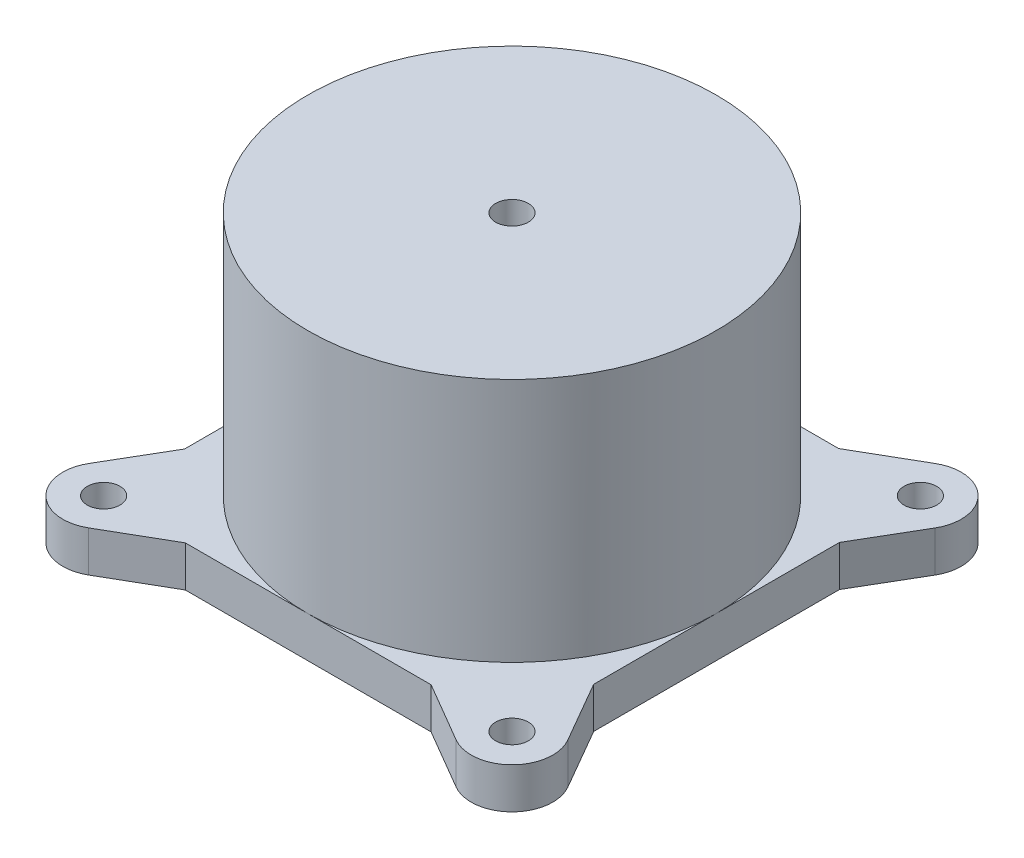
ISO-10303-21;
HEADER;
FILE_DESCRIPTION(('STEP AP214'),'2;1');
FILE_NAME('part.step','',(''),(''),'','','');
FILE_SCHEMA(('AUTOMOTIVE_DESIGN { 1 0 10303 214 1 1 1 1 }'));
ENDSEC;
DATA;
#1=APPLICATION_CONTEXT('core data for automotive mechanical design processes');
#2=APPLICATION_PROTOCOL_DEFINITION('international standard','automotive_design',2000,#1);
#3=PRODUCT_CONTEXT('',#1,'mechanical');
#4=PRODUCT('Part','Part','',(#3));
#5=PRODUCT_RELATED_PRODUCT_CATEGORY('part','',(#4));
#6=PRODUCT_DEFINITION_FORMATION('','',#4);
#7=PRODUCT_DEFINITION_CONTEXT('part definition',#1,'design');
#8=PRODUCT_DEFINITION('design','',#6,#7);
#9=PRODUCT_DEFINITION_SHAPE('','',#8);
#10=(LENGTH_UNIT() NAMED_UNIT(*) SI_UNIT(.MILLI.,.METRE.));
#11=(NAMED_UNIT(*) PLANE_ANGLE_UNIT() SI_UNIT($,.RADIAN.));
#12=(NAMED_UNIT(*) SI_UNIT($,.STERADIAN.) SOLID_ANGLE_UNIT());
#13=UNCERTAINTY_MEASURE_WITH_UNIT(LENGTH_MEASURE(1.E-05),#10,'distance_accuracy_value','');
#14=(GEOMETRIC_REPRESENTATION_CONTEXT(3) GLOBAL_UNCERTAINTY_ASSIGNED_CONTEXT((#13)) GLOBAL_UNIT_ASSIGNED_CONTEXT((#10,
#11,#12)) REPRESENTATION_CONTEXT('',''));
#15=CARTESIAN_POINT('',(0.,0.,0.));
#16=DIRECTION('',(0.,0.,1.));
#17=DIRECTION('',(1.,0.,0.));
#18=AXIS2_PLACEMENT_3D('',#15,#16,#17);
#19=CARTESIAN_POINT('',(0.,0.,0.));
#20=DIRECTION('',(0.,1.,0.));
#21=DIRECTION('',(0.,0.,1.));
#22=AXIS2_PLACEMENT_3D('',#19,#20,#21);
#23=PLANE('',#22);
#24=CARTESIAN_POINT('',(0.,0.,0.));
#25=DIRECTION('',(0.,1.,0.));
#26=DIRECTION('',(0.,0.,1.));
#27=AXIS2_PLACEMENT_3D('',#24,#25,#26);
#28=CIRCLE('',#27,4.);
#29=CARTESIAN_POINT('',(0.,0.,4.));
#30=VERTEX_POINT('',#29);
#31=EDGE_CURVE('E210',#30,#30,#28,.T.);
#32=ORIENTED_EDGE('',*,*,#31,.T.);
#33=EDGE_LOOP('',(#32));
#34=FACE_BOUND('',#33,.T.);
#35=CARTESIAN_POINT('',(0.,0.,0.));
#36=DIRECTION('',(0.,-1.,0.));
#37=DIRECTION('',(0.,0.,-1.));
#38=AXIS2_PLACEMENT_3D('',#35,#36,#37);
#39=CIRCLE('',#38,40.);
#40=CARTESIAN_POINT('',(0.,0.,-40.));
#41=VERTEX_POINT('',#40);
#42=EDGE_CURVE('E198',#41,#41,#39,.T.);
#43=ORIENTED_EDGE('',*,*,#42,.T.);
#44=EDGE_LOOP('',(#43));
#45=FACE_BOUND('',#44,.T.);
#46=ADVANCED_FACE('F50',(#34,#45),#23,.F.);
#47=CARTESIAN_POINT('',(0.,10.,0.));
#48=DIRECTION('',(0.,1.,0.));
#49=DIRECTION('',(0.,0.,1.));
#50=AXIS2_PLACEMENT_3D('',#47,#48,#49);
#51=PLANE('',#50);
#52=CARTESIAN_POINT('',(0.,10.,0.));
#53=DIRECTION('',(0.,1.,0.));
#54=DIRECTION('',(0.,0.,1.));
#55=AXIS2_PLACEMENT_3D('',#52,#53,#54);
#56=CIRCLE('',#55,50.);
#57=CARTESIAN_POINT('',(0.,10.,50.));
#58=VERTEX_POINT('',#57);
#59=EDGE_CURVE('E11',#58,#58,#56,.T.);
#60=ORIENTED_EDGE('',*,*,#59,.T.);
#61=EDGE_LOOP('',(#60));
#62=FACE_BOUND('',#61,.T.);
#63=CARTESIAN_POINT('',(0.,10.,0.));
#64=DIRECTION('',(0.,1.,0.));
#65=DIRECTION('',(0.,0.,1.));
#66=AXIS2_PLACEMENT_3D('',#63,#64,#65);
#67=CIRCLE('',#66,4.);
#68=CARTESIAN_POINT('',(0.,10.,4.));
#69=VERTEX_POINT('',#68);
#70=EDGE_CURVE('E54',#69,#69,#67,.T.);
#71=ORIENTED_EDGE('',*,*,#70,.F.);
#72=EDGE_LOOP('',(#71));
#73=FACE_BOUND('',#72,.T.);
#74=ADVANCED_FACE('F230',(#62,#73),#51,.T.);
#75=CARTESIAN_POINT('',(0.,10.,0.));
#76=DIRECTION('',(0.,-1.,0.));
#77=DIRECTION('',(0.,0.,-1.));
#78=AXIS2_PLACEMENT_3D('',#75,#76,#77);
#79=CYLINDRICAL_SURFACE('',#78,50.);
#80=ORIENTED_EDGE('',*,*,#59,.F.);
#81=EDGE_LOOP('',(#80));
#82=FACE_BOUND('',#81,.T.);
#83=CARTESIAN_POINT('',(0.,-50.,0.));
#84=DIRECTION('',(0.,-1.,0.));
#85=DIRECTION('',(0.,0.,-1.));
#86=AXIS2_PLACEMENT_3D('',#83,#84,#85);
#87=CIRCLE('',#86,50.);
#88=CARTESIAN_POINT('',(-2.35922392732846E-13,-50.,-50.0000000000002));
#89=VERTEX_POINT('',#88);
#90=CARTESIAN_POINT('',(49.9999999999999,-50.,-4.15060205382177E-13));
#91=VERTEX_POINT('',#90);
#92=EDGE_CURVE('E204',#89,#91,#87,.T.);
#93=ORIENTED_EDGE('',*,*,#92,.F.);
#94=CARTESIAN_POINT('',(-49.9999999999999,-50.,0.));
#95=VERTEX_POINT('',#94);
#96=EDGE_CURVE('E64',#95,#89,#87,.T.);
#97=ORIENTED_EDGE('',*,*,#96,.F.);
#98=CARTESIAN_POINT('',(2.36353728064851E-13,-50.,49.9999999999999));
#99=VERTEX_POINT('',#98);
#100=EDGE_CURVE('E67',#99,#95,#87,.T.);
#101=ORIENTED_EDGE('',*,*,#100,.F.);
#102=EDGE_CURVE('E208',#91,#99,#87,.T.);
#103=ORIENTED_EDGE('',*,*,#102,.F.);
#104=EDGE_LOOP('',(#93,#97,#101,#103));
#105=FACE_BOUND('',#104,.T.);
#106=ADVANCED_FACE('F47',(#82,#105),#79,.T.);
#107=CARTESIAN_POINT('',(0.,10.,0.));
#108=DIRECTION('',(0.,-1.,0.));
#109=DIRECTION('',(0.,0.,-1.));
#110=AXIS2_PLACEMENT_3D('',#107,#108,#109);
#111=CYLINDRICAL_SURFACE('',#110,4.);
#112=ORIENTED_EDGE('',*,*,#70,.T.);
#113=EDGE_LOOP('',(#112));
#114=FACE_BOUND('',#113,.T.);
#115=ORIENTED_EDGE('',*,*,#31,.F.);
#116=EDGE_LOOP('',(#115));
#117=FACE_BOUND('',#116,.T.);
#118=ADVANCED_FACE('F214',(#114,#117),#111,.F.);
#119=CARTESIAN_POINT('',(0.,-50.,0.));
#120=DIRECTION('',(0.,1.,0.));
#121=DIRECTION('',(0.,0.,1.));
#122=AXIS2_PLACEMENT_3D('',#119,#120,#121);
#123=CYLINDRICAL_SURFACE('',#122,40.);
#124=ORIENTED_EDGE('',*,*,#42,.F.);
#125=EDGE_LOOP('',(#124));
#126=FACE_BOUND('',#125,.T.);
#127=CARTESIAN_POINT('',(0.,-60.,0.));
#128=DIRECTION('',(0.,-1.,0.));
#129=DIRECTION('',(0.,0.,-1.));
#130=AXIS2_PLACEMENT_3D('',#127,#128,#129);
#131=CIRCLE('',#130,40.);
#132=CARTESIAN_POINT('',(0.,-60.,-40.));
#133=VERTEX_POINT('',#132);
#134=EDGE_CURVE('E387',#133,#133,#131,.T.);
#135=ORIENTED_EDGE('',*,*,#134,.T.);
#136=EDGE_LOOP('',(#135));
#137=FACE_BOUND('',#136,.T.);
#138=ADVANCED_FACE('F220',(#126,#137),#123,.F.);
#139=CARTESIAN_POINT('',(-50.,-50.,-50.));
#140=DIRECTION('',(0.,-1.,0.));
#141=DIRECTION('',(0.,0.,-1.));
#142=AXIS2_PLACEMENT_3D('',#139,#140,#141);
#143=PLANE('',#142);
#144=CARTESIAN_POINT('',(50.,-50.,-50.));
#145=DIRECTION('',(0.,-1.,0.));
#146=DIRECTION('',(0.,0.,1.));
#147=AXIS2_PLACEMENT_3D('',#144,#145,#146);
#148=CIRCLE('',#147,4.00000000000003);
#149=CARTESIAN_POINT('',(50.,-50.,-46.));
#150=VERTEX_POINT('',#149);
#151=EDGE_CURVE('E380',#150,#150,#148,.T.);
#152=ORIENTED_EDGE('',*,*,#151,.T.);
#153=EDGE_LOOP('',(#152));
#154=FACE_BOUND('',#153,.T.);
#155=DIRECTION('',(1.,0.,0.));
#156=VECTOR('',#155,1.);
#157=CARTESIAN_POINT('',(-30.1866521598413,-50.,-50.));
#158=LINE('',#157,#156);
#159=CARTESIAN_POINT('',(29.9974313300821,-50.,-50.0000000000003));
#160=VERTEX_POINT('',#159);
#161=EDGE_CURVE('E255',#89,#160,#158,.T.);
#162=ORIENTED_EDGE('',*,*,#161,.F.);
#163=ORIENTED_EDGE('',*,*,#92,.T.);
#164=DIRECTION('',(0.,0.,1.));
#165=VECTOR('',#164,1.);
#166=CARTESIAN_POINT('',(50.0000000000002,-50.,29.9974313300822));
#167=LINE('',#166,#165);
#168=CARTESIAN_POINT('',(49.9999999999997,-50.,-30.1866521598418));
#169=VERTEX_POINT('',#168);
#170=EDGE_CURVE('E275',#169,#91,#167,.T.);
#171=ORIENTED_EDGE('',*,*,#170,.F.);
#172=DIRECTION('',(-0.504710263034463,0.,0.863288798947191));
#173=VECTOR('',#172,1.);
#174=CARTESIAN_POINT('',(58.6328879894714,-50.,-44.9528973696559));
#175=LINE('',#174,#173);
#176=CARTESIAN_POINT('',(58.6328879894714,-50.,-44.9528973696559));
#177=VERTEX_POINT('',#176);
#178=EDGE_CURVE('E267',#177,#169,#175,.T.);
#179=ORIENTED_EDGE('',*,*,#178,.F.);
#180=CARTESIAN_POINT('',(49.9999999999995,-50.,-50.0000000000005));
#181=DIRECTION('',(0.,-1.,0.));
#182=DIRECTION('',(0.,0.,-1.));
#183=AXIS2_PLACEMENT_3D('',#180,#181,#182);
#184=CIRCLE('',#183,9.99999999999999);
#185=CARTESIAN_POINT('',(45.0006420850135,-50.,-58.6606247140651));
#186=VERTEX_POINT('',#185);
#187=EDGE_CURVE('E263',#186,#177,#184,.T.);
#188=ORIENTED_EDGE('',*,*,#187,.F.);
#189=DIRECTION('',(0.866062471406464,0.,-0.499935791498596));
#190=VECTOR('',#189,1.);
#191=CARTESIAN_POINT('',(45.0006420850135,-50.,-58.6606247140652));
#192=LINE('',#191,#190);
#193=EDGE_CURVE('E258',#160,#186,#192,.T.);
#194=ORIENTED_EDGE('',*,*,#193,.F.);
#195=EDGE_LOOP('',(#162,#163,#171,#179,#188,#194));
#196=FACE_BOUND('',#195,.T.);
#197=ADVANCED_FACE('F223',(#154,#196),#143,.F.);
#198=CARTESIAN_POINT('',(50.,-50.,50.));
#199=DIRECTION('',(0.,-1.,0.));
#200=DIRECTION('',(0.,0.,1.));
#201=AXIS2_PLACEMENT_3D('',#198,#199,#200);
#202=CIRCLE('',#201,4.00000000000001);
#203=CARTESIAN_POINT('',(50.,-50.,54.));
#204=VERTEX_POINT('',#203);
#205=EDGE_CURVE('E382',#204,#204,#202,.T.);
#206=ORIENTED_EDGE('',*,*,#205,.T.);
#207=EDGE_LOOP('',(#206));
#208=FACE_BOUND('',#207,.T.);
#209=CARTESIAN_POINT('',(50.0000000000002,-50.,29.9974313300822));
#210=VERTEX_POINT('',#209);
#211=EDGE_CURVE('E271',#91,#210,#167,.T.);
#212=ORIENTED_EDGE('',*,*,#211,.F.);
#213=ORIENTED_EDGE('',*,*,#102,.T.);
#214=DIRECTION('',(-1.,0.,0.));
#215=VECTOR('',#214,1.);
#216=CARTESIAN_POINT('',(-29.9974313300824,-50.,50.0000000000001));
#217=LINE('',#216,#215);
#218=CARTESIAN_POINT('',(30.1866521598416,-50.,49.9999999999998));
#219=VERTEX_POINT('',#218);
#220=EDGE_CURVE('E284',#219,#99,#217,.T.);
#221=ORIENTED_EDGE('',*,*,#220,.F.);
#222=DIRECTION('',(-0.863288798947189,0.,-0.504710263034466));
#223=VECTOR('',#222,1.);
#224=CARTESIAN_POINT('',(44.9528973696557,-50.,58.6328879894715));
#225=LINE('',#224,#223);
#226=CARTESIAN_POINT('',(44.9528973696557,-50.,58.6328879894715));
#227=VERTEX_POINT('',#226);
#228=EDGE_CURVE('E276',#227,#219,#225,.T.);
#229=ORIENTED_EDGE('',*,*,#228,.F.);
#230=CARTESIAN_POINT('',(50.0000000000003,-50.,49.9999999999997));
#231=DIRECTION('',(0.,-1.,0.));
#232=DIRECTION('',(0.,0.,-1.));
#233=AXIS2_PLACEMENT_3D('',#230,#231,#232);
#234=CIRCLE('',#233,9.99999999999999);
#235=CARTESIAN_POINT('',(58.660624714065,-50.,45.0006420850137));
#236=VERTEX_POINT('',#235);
#237=EDGE_CURVE('E280',#236,#227,#234,.T.);
#238=ORIENTED_EDGE('',*,*,#237,.F.);
#239=DIRECTION('',(0.499935791498592,0.,0.866062471406466));
#240=VECTOR('',#239,1.);
#241=CARTESIAN_POINT('',(58.660624714065,-50.,45.0006420850137));
#242=LINE('',#241,#240);
#243=EDGE_CURVE('E274',#210,#236,#242,.T.);
#244=ORIENTED_EDGE('',*,*,#243,.F.);
#245=EDGE_LOOP('',(#212,#213,#221,#229,#238,#244));
#246=FACE_BOUND('',#245,.T.);
#247=ADVANCED_FACE('F412',(#208,#246),#143,.F.);
#248=CARTESIAN_POINT('',(-50.,-50.,50.));
#249=DIRECTION('',(0.,-1.,0.));
#250=DIRECTION('',(0.,0.,-1.));
#251=AXIS2_PLACEMENT_3D('',#248,#249,#250);
#252=CIRCLE('',#251,4.00000000000001);
#253=CARTESIAN_POINT('',(-50.,-50.,46.));
#254=VERTEX_POINT('',#253);
#255=EDGE_CURVE('E361',#254,#254,#252,.T.);
#256=ORIENTED_EDGE('',*,*,#255,.T.);
#257=EDGE_LOOP('',(#256));
#258=FACE_BOUND('',#257,.T.);
#259=CARTESIAN_POINT('',(-29.9974313300824,-50.,50.0000000000001));
#260=VERTEX_POINT('',#259);
#261=EDGE_CURVE('E283',#99,#260,#217,.T.);
#262=ORIENTED_EDGE('',*,*,#261,.F.);
#263=ORIENTED_EDGE('',*,*,#100,.T.);
#264=DIRECTION('',(0.,0.,-1.));
#265=VECTOR('',#264,1.);
#266=CARTESIAN_POINT('',(-49.9999999999999,-50.,30.1866521598415));
#267=LINE('',#266,#265);
#268=CARTESIAN_POINT('',(-49.9999999999999,-50.,30.1866521598415));
#269=VERTEX_POINT('',#268);
#270=EDGE_CURVE('E292',#269,#95,#267,.T.);
#271=ORIENTED_EDGE('',*,*,#270,.F.);
#272=DIRECTION('',(0.504710263034469,0.,-0.863288798947187));
#273=VECTOR('',#272,1.);
#274=CARTESIAN_POINT('',(-58.6328879894717,-50.,44.9528973696555));
#275=LINE('',#274,#273);
#276=CARTESIAN_POINT('',(-58.6328879894717,-50.,44.9528973696555));
#277=VERTEX_POINT('',#276);
#278=EDGE_CURVE('E286',#277,#269,#275,.T.);
#279=ORIENTED_EDGE('',*,*,#278,.F.);
#280=CARTESIAN_POINT('',(-49.9999999999998,-50.,50.0000000000002));
#281=DIRECTION('',(0.,-1.,0.));
#282=DIRECTION('',(0.,0.,-1.));
#283=AXIS2_PLACEMENT_3D('',#280,#281,#282);
#284=CIRCLE('',#283,9.99999999999999);
#285=CARTESIAN_POINT('',(-45.0006420850139,-50.,58.6606247140648));
#286=VERTEX_POINT('',#285);
#287=EDGE_CURVE('E289',#286,#277,#284,.T.);
#288=ORIENTED_EDGE('',*,*,#287,.F.);
#289=DIRECTION('',(-0.866062471406468,0.,0.49993579149859));
#290=VECTOR('',#289,1.);
#291=CARTESIAN_POINT('',(-45.0006420850139,-50.,58.6606247140648));
#292=LINE('',#291,#290);
#293=EDGE_CURVE('E281',#260,#286,#292,.T.);
#294=ORIENTED_EDGE('',*,*,#293,.F.);
#295=EDGE_LOOP('',(#262,#263,#271,#279,#288,#294));
#296=FACE_BOUND('',#295,.T.);
#297=ADVANCED_FACE('F402',(#258,#296),#143,.F.);
#298=CARTESIAN_POINT('',(-50.,-50.,-50.));
#299=DIRECTION('',(0.,-1.,0.));
#300=DIRECTION('',(0.,0.,-1.));
#301=AXIS2_PLACEMENT_3D('',#298,#299,#300);
#302=CIRCLE('',#301,4.00000000000001);
#303=CARTESIAN_POINT('',(-50.,-50.,-54.));
#304=VERTEX_POINT('',#303);
#305=EDGE_CURVE('E371',#304,#304,#302,.T.);
#306=ORIENTED_EDGE('',*,*,#305,.T.);
#307=EDGE_LOOP('',(#306));
#308=FACE_BOUND('',#307,.T.);
#309=CARTESIAN_POINT('',(-50.,-50.,-29.9974313300826));
#310=VERTEX_POINT('',#309);
#311=EDGE_CURVE('E253',#95,#310,#267,.T.);
#312=ORIENTED_EDGE('',*,*,#311,.F.);
#313=ORIENTED_EDGE('',*,*,#96,.T.);
#314=CARTESIAN_POINT('',(-30.1866521598413,-50.,-50.));
#315=VERTEX_POINT('',#314);
#316=EDGE_CURVE('E246',#315,#89,#158,.T.);
#317=ORIENTED_EDGE('',*,*,#316,.F.);
#318=DIRECTION('',(0.863288798947185,0.,0.504710263034473));
#319=VECTOR('',#318,1.);
#320=CARTESIAN_POINT('',(-44.9528973696553,-50.,-58.6328879894719));
#321=LINE('',#320,#319);
#322=CARTESIAN_POINT('',(-44.9528973696553,-50.,-58.6328879894719));
#323=VERTEX_POINT('',#322);
#324=EDGE_CURVE('E257',#323,#315,#321,.T.);
#325=ORIENTED_EDGE('',*,*,#324,.F.);
#326=CARTESIAN_POINT('',(-50.,-50.,-50.));
#327=DIRECTION('',(0.,-1.,0.));
#328=DIRECTION('',(0.,0.,-1.));
#329=AXIS2_PLACEMENT_3D('',#326,#327,#328);
#330=CIRCLE('',#329,10.);
#331=CARTESIAN_POINT('',(-58.6606247140647,-50.,-45.0006420850141));
#332=VERTEX_POINT('',#331);
#333=EDGE_CURVE('E193',#332,#323,#330,.T.);
#334=ORIENTED_EDGE('',*,*,#333,.F.);
#335=DIRECTION('',(-0.499935791498586,0.,-0.86606247140647));
#336=VECTOR('',#335,1.);
#337=CARTESIAN_POINT('',(-58.6606247140647,-50.,-45.0006420850141));
#338=LINE('',#337,#336);
#339=EDGE_CURVE('E192',#310,#332,#338,.T.);
#340=ORIENTED_EDGE('',*,*,#339,.F.);
#341=EDGE_LOOP('',(#312,#313,#317,#325,#334,#340));
#342=FACE_BOUND('',#341,.T.);
#343=ADVANCED_FACE('F249',(#308,#342),#143,.F.);
#344=CARTESIAN_POINT('',(-50.,-60.,-50.));
#345=DIRECTION('',(0.,-1.,0.));
#346=DIRECTION('',(0.,0.,-1.));
#347=AXIS2_PLACEMENT_3D('',#344,#345,#346);
#348=PLANE('',#347);
#349=CARTESIAN_POINT('',(50.,-60.,50.));
#350=DIRECTION('',(0.,-1.,0.));
#351=DIRECTION('',(0.,0.,1.));
#352=AXIS2_PLACEMENT_3D('',#349,#350,#351);
#353=CIRCLE('',#352,4.00000000000001);
#354=CARTESIAN_POINT('',(50.,-60.,54.));
#355=VERTEX_POINT('',#354);
#356=EDGE_CURVE('E379',#355,#355,#353,.T.);
#357=ORIENTED_EDGE('',*,*,#356,.F.);
#358=EDGE_LOOP('',(#357));
#359=FACE_BOUND('',#358,.T.);
#360=CARTESIAN_POINT('',(-50.,-60.,-50.));
#361=DIRECTION('',(0.,-1.,0.));
#362=DIRECTION('',(0.,0.,-1.));
#363=AXIS2_PLACEMENT_3D('',#360,#361,#362);
#364=CIRCLE('',#363,4.00000000000001);
#365=CARTESIAN_POINT('',(-50.,-60.,-54.));
#366=VERTEX_POINT('',#365);
#367=EDGE_CURVE('E366',#366,#366,#364,.T.);
#368=ORIENTED_EDGE('',*,*,#367,.F.);
#369=EDGE_LOOP('',(#368));
#370=FACE_BOUND('',#369,.T.);
#371=CARTESIAN_POINT('',(-50.,-60.,-50.));
#372=DIRECTION('',(0.,-1.,0.));
#373=DIRECTION('',(0.,0.,-1.));
#374=AXIS2_PLACEMENT_3D('',#371,#372,#373);
#375=CIRCLE('',#374,10.);
#376=CARTESIAN_POINT('',(-58.6606247140647,-60.,-45.0006420850141));
#377=VERTEX_POINT('',#376);
#378=CARTESIAN_POINT('',(-44.9528973696553,-60.,-58.6328879894719));
#379=VERTEX_POINT('',#378);
#380=EDGE_CURVE('E182',#377,#379,#375,.T.);
#381=ORIENTED_EDGE('',*,*,#380,.T.);
#382=DIRECTION('',(0.863288798947185,0.,0.504710263034473));
#383=VECTOR('',#382,1.);
#384=CARTESIAN_POINT('',(-44.9528973696553,-60.,-58.6328879894719));
#385=LINE('',#384,#383);
#386=CARTESIAN_POINT('',(-30.1866521598413,-60.,-50.));
#387=VERTEX_POINT('',#386);
#388=EDGE_CURVE('E168',#379,#387,#385,.T.);
#389=ORIENTED_EDGE('',*,*,#388,.T.);
#390=DIRECTION('',(1.,0.,0.));
#391=VECTOR('',#390,1.);
#392=CARTESIAN_POINT('',(-30.1866521598413,-60.,-50.));
#393=LINE('',#392,#391);
#394=CARTESIAN_POINT('',(29.9974313300821,-60.,-50.0000000000003));
#395=VERTEX_POINT('',#394);
#396=EDGE_CURVE('E178',#387,#395,#393,.T.);
#397=ORIENTED_EDGE('',*,*,#396,.T.);
#398=DIRECTION('',(0.866062471406464,0.,-0.499935791498596));
#399=VECTOR('',#398,1.);
#400=CARTESIAN_POINT('',(45.0006420850135,-60.,-58.6606247140652));
#401=LINE('',#400,#399);
#402=CARTESIAN_POINT('',(45.0006420850135,-60.,-58.6606247140651));
#403=VERTEX_POINT('',#402);
#404=EDGE_CURVE('E333',#395,#403,#401,.T.);
#405=ORIENTED_EDGE('',*,*,#404,.T.);
#406=CARTESIAN_POINT('',(49.9999999999995,-60.,-50.0000000000005));
#407=DIRECTION('',(0.,-1.,0.));
#408=DIRECTION('',(0.,0.,-1.));
#409=AXIS2_PLACEMENT_3D('',#406,#407,#408);
#410=CIRCLE('',#409,9.99999999999999);
#411=CARTESIAN_POINT('',(58.6328879894714,-60.,-44.9528973696559));
#412=VERTEX_POINT('',#411);
#413=EDGE_CURVE('E339',#403,#412,#410,.T.);
#414=ORIENTED_EDGE('',*,*,#413,.T.);
#415=DIRECTION('',(-0.504710263034463,0.,0.863288798947191));
#416=VECTOR('',#415,1.);
#417=CARTESIAN_POINT('',(58.6328879894714,-60.,-44.9528973696559));
#418=LINE('',#417,#416);
#419=CARTESIAN_POINT('',(49.9999999999997,-60.,-30.1866521598418));
#420=VERTEX_POINT('',#419);
#421=EDGE_CURVE('E342',#412,#420,#418,.T.);
#422=ORIENTED_EDGE('',*,*,#421,.T.);
#423=DIRECTION('',(0.,0.,1.));
#424=VECTOR('',#423,1.);
#425=CARTESIAN_POINT('',(50.0000000000002,-60.,29.9974313300822));
#426=LINE('',#425,#424);
#427=CARTESIAN_POINT('',(50.0000000000002,-60.,29.9974313300822));
#428=VERTEX_POINT('',#427);
#429=EDGE_CURVE('E345',#420,#428,#426,.T.);
#430=ORIENTED_EDGE('',*,*,#429,.T.);
#431=DIRECTION('',(0.499935791498592,0.,0.866062471406466));
#432=VECTOR('',#431,1.);
#433=CARTESIAN_POINT('',(58.660624714065,-60.,45.0006420850137));
#434=LINE('',#433,#432);
#435=CARTESIAN_POINT('',(58.660624714065,-60.,45.0006420850137));
#436=VERTEX_POINT('',#435);
#437=EDGE_CURVE('E343',#428,#436,#434,.T.);
#438=ORIENTED_EDGE('',*,*,#437,.T.);
#439=CARTESIAN_POINT('',(50.0000000000003,-60.,49.9999999999997));
#440=DIRECTION('',(0.,-1.,0.));
#441=DIRECTION('',(0.,0.,-1.));
#442=AXIS2_PLACEMENT_3D('',#439,#440,#441);
#443=CIRCLE('',#442,9.99999999999999);
#444=CARTESIAN_POINT('',(44.9528973696557,-60.,58.6328879894715));
#445=VERTEX_POINT('',#444);
#446=EDGE_CURVE('E350',#436,#445,#443,.T.);
#447=ORIENTED_EDGE('',*,*,#446,.T.);
#448=DIRECTION('',(-0.863288798947189,0.,-0.504710263034466));
#449=VECTOR('',#448,1.);
#450=CARTESIAN_POINT('',(44.9528973696557,-60.,58.6328879894715));
#451=LINE('',#450,#449);
#452=CARTESIAN_POINT('',(30.1866521598416,-60.,49.9999999999998));
#453=VERTEX_POINT('',#452);
#454=EDGE_CURVE('E349',#445,#453,#451,.T.);
#455=ORIENTED_EDGE('',*,*,#454,.T.);
#456=DIRECTION('',(-1.,0.,0.));
#457=VECTOR('',#456,1.);
#458=CARTESIAN_POINT('',(-29.9974313300824,-60.,50.0000000000001));
#459=LINE('',#458,#457);
#460=CARTESIAN_POINT('',(-29.9974313300824,-60.,50.0000000000001));
#461=VERTEX_POINT('',#460);
#462=EDGE_CURVE('E353',#453,#461,#459,.T.);
#463=ORIENTED_EDGE('',*,*,#462,.T.);
#464=DIRECTION('',(-0.866062471406468,0.,0.49993579149859));
#465=VECTOR('',#464,1.);
#466=CARTESIAN_POINT('',(-45.0006420850139,-60.,58.6606247140648));
#467=LINE('',#466,#465);
#468=CARTESIAN_POINT('',(-45.0006420850139,-60.,58.6606247140648));
#469=VERTEX_POINT('',#468);
#470=EDGE_CURVE('E352',#461,#469,#467,.T.);
#471=ORIENTED_EDGE('',*,*,#470,.T.);
#472=CARTESIAN_POINT('',(-49.9999999999998,-60.,50.0000000000002));
#473=DIRECTION('',(0.,-1.,0.));
#474=DIRECTION('',(0.,0.,-1.));
#475=AXIS2_PLACEMENT_3D('',#472,#473,#474);
#476=CIRCLE('',#475,9.99999999999999);
#477=CARTESIAN_POINT('',(-58.6328879894717,-60.,44.9528973696555));
#478=VERTEX_POINT('',#477);
#479=EDGE_CURVE('E351',#469,#478,#476,.T.);
#480=ORIENTED_EDGE('',*,*,#479,.T.);
#481=DIRECTION('',(0.504710263034469,0.,-0.863288798947187));
#482=VECTOR('',#481,1.);
#483=CARTESIAN_POINT('',(-58.6328879894717,-60.,44.9528973696555));
#484=LINE('',#483,#482);
#485=CARTESIAN_POINT('',(-49.9999999999999,-60.,30.1866521598415));
#486=VERTEX_POINT('',#485);
#487=EDGE_CURVE('E359',#478,#486,#484,.T.);
#488=ORIENTED_EDGE('',*,*,#487,.T.);
#489=DIRECTION('',(0.,0.,-1.));
#490=VECTOR('',#489,1.);
#491=CARTESIAN_POINT('',(-49.9999999999999,-60.,30.1866521598415));
#492=LINE('',#491,#490);
#493=CARTESIAN_POINT('',(-50.,-60.,-29.9974313300826));
#494=VERTEX_POINT('',#493);
#495=EDGE_CURVE('E356',#486,#494,#492,.T.);
#496=ORIENTED_EDGE('',*,*,#495,.T.);
#497=DIRECTION('',(-0.499935791498586,0.,-0.86606247140647));
#498=VECTOR('',#497,1.);
#499=CARTESIAN_POINT('',(-58.6606247140647,-60.,-45.0006420850141));
#500=LINE('',#499,#498);
#501=EDGE_CURVE('E189',#494,#377,#500,.T.);
#502=ORIENTED_EDGE('',*,*,#501,.T.);
#503=EDGE_LOOP('',(#381,#389,#397,#405,#414,#422,#430,#438,#447,#455,#463,#471,#480,#488,#496,#502));
#504=FACE_BOUND('',#503,.T.);
#505=CARTESIAN_POINT('',(-50.,-60.,50.));
#506=DIRECTION('',(0.,-1.,0.));
#507=DIRECTION('',(0.,0.,-1.));
#508=AXIS2_PLACEMENT_3D('',#505,#506,#507);
#509=CIRCLE('',#508,4.00000000000001);
#510=CARTESIAN_POINT('',(-50.,-60.,46.));
#511=VERTEX_POINT('',#510);
#512=EDGE_CURVE('E363',#511,#511,#509,.T.);
#513=ORIENTED_EDGE('',*,*,#512,.F.);
#514=EDGE_LOOP('',(#513));
#515=FACE_BOUND('',#514,.T.);
#516=CARTESIAN_POINT('',(50.,-60.,-50.));
#517=DIRECTION('',(0.,-1.,0.));
#518=DIRECTION('',(0.,0.,1.));
#519=AXIS2_PLACEMENT_3D('',#516,#517,#518);
#520=CIRCLE('',#519,4.00000000000003);
#521=CARTESIAN_POINT('',(50.,-60.,-46.));
#522=VERTEX_POINT('',#521);
#523=EDGE_CURVE('E372',#522,#522,#520,.T.);
#524=ORIENTED_EDGE('',*,*,#523,.F.);
#525=EDGE_LOOP('',(#524));
#526=FACE_BOUND('',#525,.T.);
#527=ORIENTED_EDGE('',*,*,#134,.F.);
#528=EDGE_LOOP('',(#527));
#529=FACE_BOUND('',#528,.T.);
#530=ADVANCED_FACE('F184',(#359,#370,#504,#515,#526,#529),#348,.T.);
#531=CARTESIAN_POINT('',(-50.,-60.,-50.));
#532=DIRECTION('',(0.,1.,0.));
#533=DIRECTION('',(0.,0.,1.));
#534=AXIS2_PLACEMENT_3D('',#531,#532,#533);
#535=CYLINDRICAL_SURFACE('',#534,10.);
#536=ORIENTED_EDGE('',*,*,#333,.T.);
#537=DIRECTION('',(0.,1.,0.));
#538=VECTOR('',#537,1.);
#539=CARTESIAN_POINT('',(-44.9528973696553,-60.,-58.6328879894719));
#540=LINE('',#539,#538);
#541=EDGE_CURVE('E175',#379,#323,#540,.T.);
#542=ORIENTED_EDGE('',*,*,#541,.F.);
#543=ORIENTED_EDGE('',*,*,#380,.F.);
#544=DIRECTION('',(0.,1.,0.));
#545=VECTOR('',#544,1.);
#546=CARTESIAN_POINT('',(-58.6606247140647,-60.,-45.0006420850141));
#547=LINE('',#546,#545);
#548=EDGE_CURVE('E294',#377,#332,#547,.T.);
#549=ORIENTED_EDGE('',*,*,#548,.T.);
#550=EDGE_LOOP('',(#536,#542,#543,#549));
#551=FACE_BOUND('',#550,.T.);
#552=ADVANCED_FACE('F195',(#551),#535,.T.);
#553=CARTESIAN_POINT('',(-44.9528973696553,-60.,-58.6328879894719));
#554=DIRECTION('',(-0.504710263034473,0.,0.863288798947185));
#555=DIRECTION('',(0.863288798947185,0.,0.504710263034473));
#556=AXIS2_PLACEMENT_3D('',#553,#554,#555);
#557=PLANE('',#556);
#558=ORIENTED_EDGE('',*,*,#324,.T.);
#559=DIRECTION('',(0.,1.,0.));
#560=VECTOR('',#559,1.);
#561=CARTESIAN_POINT('',(-30.1866521598413,-60.,-50.));
#562=LINE('',#561,#560);
#563=EDGE_CURVE('E179',#387,#315,#562,.T.);
#564=ORIENTED_EDGE('',*,*,#563,.F.);
#565=ORIENTED_EDGE('',*,*,#388,.F.);
#566=ORIENTED_EDGE('',*,*,#541,.T.);
#567=EDGE_LOOP('',(#558,#564,#565,#566));
#568=FACE_BOUND('',#567,.T.);
#569=ADVANCED_FACE('F174',(#568),#557,.F.);
#570=CARTESIAN_POINT('',(-30.1866521598413,-60.,-50.));
#571=DIRECTION('',(0.,0.,1.));
#572=DIRECTION('',(1.,0.,0.));
#573=AXIS2_PLACEMENT_3D('',#570,#571,#572);
#574=PLANE('',#573);
#575=ORIENTED_EDGE('',*,*,#316,.T.);
#576=ORIENTED_EDGE('',*,*,#161,.T.);
#577=DIRECTION('',(0.,1.,0.));
#578=VECTOR('',#577,1.);
#579=CARTESIAN_POINT('',(29.9974313300821,-60.,-50.0000000000003));
#580=LINE('',#579,#578);
#581=EDGE_CURVE('E199',#395,#160,#580,.T.);
#582=ORIENTED_EDGE('',*,*,#581,.F.);
#583=ORIENTED_EDGE('',*,*,#396,.F.);
#584=ORIENTED_EDGE('',*,*,#563,.T.);
#585=EDGE_LOOP('',(#575,#576,#582,#583,#584));
#586=FACE_BOUND('',#585,.T.);
#587=ADVANCED_FACE('F265',(#586),#574,.F.);
#588=CARTESIAN_POINT('',(45.0006420850135,-60.,-58.6606247140652));
#589=DIRECTION('',(0.499935791498596,0.,0.866062471406464));
#590=DIRECTION('',(0.866062471406464,0.,-0.499935791498596));
#591=AXIS2_PLACEMENT_3D('',#588,#589,#590);
#592=PLANE('',#591);
#593=ORIENTED_EDGE('',*,*,#193,.T.);
#594=DIRECTION('',(0.,1.,0.));
#595=VECTOR('',#594,1.);
#596=CARTESIAN_POINT('',(45.0006420850135,-60.,-58.6606247140651));
#597=LINE('',#596,#595);
#598=EDGE_CURVE('E328',#403,#186,#597,.T.);
#599=ORIENTED_EDGE('',*,*,#598,.F.);
#600=ORIENTED_EDGE('',*,*,#404,.F.);
#601=ORIENTED_EDGE('',*,*,#581,.T.);
#602=EDGE_LOOP('',(#593,#599,#600,#601));
#603=FACE_BOUND('',#602,.T.);
#604=ADVANCED_FACE('F334',(#603),#592,.F.);
#605=CARTESIAN_POINT('',(49.9999999999995,-60.,-50.0000000000005));
#606=DIRECTION('',(0.,1.,0.));
#607=DIRECTION('',(0.,0.,1.));
#608=AXIS2_PLACEMENT_3D('',#605,#606,#607);
#609=CYLINDRICAL_SURFACE('',#608,9.99999999999999);
#610=ORIENTED_EDGE('',*,*,#187,.T.);
#611=DIRECTION('',(0.,1.,0.));
#612=VECTOR('',#611,1.);
#613=CARTESIAN_POINT('',(58.6328879894714,-60.,-44.9528973696559));
#614=LINE('',#613,#612);
#615=EDGE_CURVE('E326',#412,#177,#614,.T.);
#616=ORIENTED_EDGE('',*,*,#615,.F.);
#617=ORIENTED_EDGE('',*,*,#413,.F.);
#618=ORIENTED_EDGE('',*,*,#598,.T.);
#619=EDGE_LOOP('',(#610,#616,#617,#618));
#620=FACE_BOUND('',#619,.T.);
#621=ADVANCED_FACE('F457',(#620),#609,.T.);
#622=CARTESIAN_POINT('',(58.6328879894714,-60.,-44.9528973696559));
#623=DIRECTION('',(-0.863288798947191,0.,-0.504710263034463));
#624=DIRECTION('',(-0.504710263034463,0.,0.863288798947191));
#625=AXIS2_PLACEMENT_3D('',#622,#623,#624);
#626=PLANE('',#625);
#627=ORIENTED_EDGE('',*,*,#178,.T.);
#628=DIRECTION('',(0.,1.,0.));
#629=VECTOR('',#628,1.);
#630=CARTESIAN_POINT('',(49.9999999999997,-60.,-30.1866521598418));
#631=LINE('',#630,#629);
#632=EDGE_CURVE('E323',#420,#169,#631,.T.);
#633=ORIENTED_EDGE('',*,*,#632,.F.);
#634=ORIENTED_EDGE('',*,*,#421,.F.);
#635=ORIENTED_EDGE('',*,*,#615,.T.);
#636=EDGE_LOOP('',(#627,#633,#634,#635));
#637=FACE_BOUND('',#636,.T.);
#638=ADVANCED_FACE('F454',(#637),#626,.F.);
#639=CARTESIAN_POINT('',(50.0000000000002,-60.,29.9974313300822));
#640=DIRECTION('',(-1.,0.,0.));
#641=DIRECTION('',(0.,0.,1.));
#642=AXIS2_PLACEMENT_3D('',#639,#640,#641);
#643=PLANE('',#642);
#644=ORIENTED_EDGE('',*,*,#170,.T.);
#645=ORIENTED_EDGE('',*,*,#211,.T.);
#646=DIRECTION('',(0.,1.,0.));
#647=VECTOR('',#646,1.);
#648=CARTESIAN_POINT('',(50.0000000000002,-60.,29.9974313300822));
#649=LINE('',#648,#647);
#650=EDGE_CURVE('E319',#428,#210,#649,.T.);
#651=ORIENTED_EDGE('',*,*,#650,.F.);
#652=ORIENTED_EDGE('',*,*,#429,.F.);
#653=ORIENTED_EDGE('',*,*,#632,.T.);
#654=EDGE_LOOP('',(#644,#645,#651,#652,#653));
#655=FACE_BOUND('',#654,.T.);
#656=ADVANCED_FACE('F447',(#655),#643,.F.);
#657=CARTESIAN_POINT('',(58.660624714065,-60.,45.0006420850137));
#658=DIRECTION('',(-0.866062471406466,0.,0.499935791498592));
#659=DIRECTION('',(0.499935791498592,0.,0.866062471406466));
#660=AXIS2_PLACEMENT_3D('',#657,#658,#659);
#661=PLANE('',#660);
#662=ORIENTED_EDGE('',*,*,#243,.T.);
#663=DIRECTION('',(0.,1.,0.));
#664=VECTOR('',#663,1.);
#665=CARTESIAN_POINT('',(58.660624714065,-60.,45.0006420850137));
#666=LINE('',#665,#664);
#667=EDGE_CURVE('E320',#436,#236,#666,.T.);
#668=ORIENTED_EDGE('',*,*,#667,.F.);
#669=ORIENTED_EDGE('',*,*,#437,.F.);
#670=ORIENTED_EDGE('',*,*,#650,.T.);
#671=EDGE_LOOP('',(#662,#668,#669,#670));
#672=FACE_BOUND('',#671,.T.);
#673=ADVANCED_FACE('F441',(#672),#661,.F.);
#674=CARTESIAN_POINT('',(50.0000000000003,-60.,49.9999999999997));
#675=DIRECTION('',(0.,1.,0.));
#676=DIRECTION('',(0.,0.,1.));
#677=AXIS2_PLACEMENT_3D('',#674,#675,#676);
#678=CYLINDRICAL_SURFACE('',#677,9.99999999999999);
#679=ORIENTED_EDGE('',*,*,#237,.T.);
#680=DIRECTION('',(0.,1.,0.));
#681=VECTOR('',#680,1.);
#682=CARTESIAN_POINT('',(44.9528973696557,-60.,58.6328879894715));
#683=LINE('',#682,#681);
#684=EDGE_CURVE('E314',#445,#227,#683,.T.);
#685=ORIENTED_EDGE('',*,*,#684,.F.);
#686=ORIENTED_EDGE('',*,*,#446,.F.);
#687=ORIENTED_EDGE('',*,*,#667,.T.);
#688=EDGE_LOOP('',(#679,#685,#686,#687));
#689=FACE_BOUND('',#688,.T.);
#690=ADVANCED_FACE('F439',(#689),#678,.T.);
#691=CARTESIAN_POINT('',(44.9528973696557,-60.,58.6328879894715));
#692=DIRECTION('',(0.504710263034466,0.,-0.863288798947189));
#693=DIRECTION('',(-0.863288798947189,0.,-0.504710263034466));
#694=AXIS2_PLACEMENT_3D('',#691,#692,#693);
#695=PLANE('',#694);
#696=ORIENTED_EDGE('',*,*,#228,.T.);
#697=DIRECTION('',(0.,1.,0.));
#698=VECTOR('',#697,1.);
#699=CARTESIAN_POINT('',(30.1866521598416,-60.,49.9999999999998));
#700=LINE('',#699,#698);
#701=EDGE_CURVE('E313',#453,#219,#700,.T.);
#702=ORIENTED_EDGE('',*,*,#701,.F.);
#703=ORIENTED_EDGE('',*,*,#454,.F.);
#704=ORIENTED_EDGE('',*,*,#684,.T.);
#705=EDGE_LOOP('',(#696,#702,#703,#704));
#706=FACE_BOUND('',#705,.T.);
#707=ADVANCED_FACE('F436',(#706),#695,.F.);
#708=CARTESIAN_POINT('',(-29.9974313300824,-60.,50.0000000000001));
#709=DIRECTION('',(0.,0.,-1.));
#710=DIRECTION('',(-1.,0.,0.));
#711=AXIS2_PLACEMENT_3D('',#708,#709,#710);
#712=PLANE('',#711);
#713=ORIENTED_EDGE('',*,*,#220,.T.);
#714=ORIENTED_EDGE('',*,*,#261,.T.);
#715=DIRECTION('',(0.,1.,0.));
#716=VECTOR('',#715,1.);
#717=CARTESIAN_POINT('',(-29.9974313300824,-60.,50.0000000000001));
#718=LINE('',#717,#716);
#719=EDGE_CURVE('E306',#461,#260,#718,.T.);
#720=ORIENTED_EDGE('',*,*,#719,.F.);
#721=ORIENTED_EDGE('',*,*,#462,.F.);
#722=ORIENTED_EDGE('',*,*,#701,.T.);
#723=EDGE_LOOP('',(#713,#714,#720,#721,#722));
#724=FACE_BOUND('',#723,.T.);
#725=ADVANCED_FACE('F435',(#724),#712,.F.);
#726=CARTESIAN_POINT('',(-45.0006420850139,-60.,58.6606247140648));
#727=DIRECTION('',(-0.49993579149859,0.,-0.866062471406468));
#728=DIRECTION('',(-0.866062471406468,0.,0.49993579149859));
#729=AXIS2_PLACEMENT_3D('',#726,#727,#728);
#730=PLANE('',#729);
#731=ORIENTED_EDGE('',*,*,#293,.T.);
#732=DIRECTION('',(0.,1.,0.));
#733=VECTOR('',#732,1.);
#734=CARTESIAN_POINT('',(-45.0006420850139,-60.,58.6606247140648));
#735=LINE('',#734,#733);
#736=EDGE_CURVE('E303',#469,#286,#735,.T.);
#737=ORIENTED_EDGE('',*,*,#736,.F.);
#738=ORIENTED_EDGE('',*,*,#470,.F.);
#739=ORIENTED_EDGE('',*,*,#719,.T.);
#740=EDGE_LOOP('',(#731,#737,#738,#739));
#741=FACE_BOUND('',#740,.T.);
#742=ADVANCED_FACE('F428',(#741),#730,.F.);
#743=CARTESIAN_POINT('',(-49.9999999999998,-60.,50.0000000000002));
#744=DIRECTION('',(0.,1.,0.));
#745=DIRECTION('',(0.,0.,1.));
#746=AXIS2_PLACEMENT_3D('',#743,#744,#745);
#747=CYLINDRICAL_SURFACE('',#746,9.99999999999999);
#748=ORIENTED_EDGE('',*,*,#287,.T.);
#749=DIRECTION('',(0.,1.,0.));
#750=VECTOR('',#749,1.);
#751=CARTESIAN_POINT('',(-58.6328879894717,-60.,44.9528973696555));
#752=LINE('',#751,#750);
#753=EDGE_CURVE('E304',#478,#277,#752,.T.);
#754=ORIENTED_EDGE('',*,*,#753,.F.);
#755=ORIENTED_EDGE('',*,*,#479,.F.);
#756=ORIENTED_EDGE('',*,*,#736,.T.);
#757=EDGE_LOOP('',(#748,#754,#755,#756));
#758=FACE_BOUND('',#757,.T.);
#759=ADVANCED_FACE('F424',(#758),#747,.T.);
#760=CARTESIAN_POINT('',(-58.6328879894717,-60.,44.9528973696555));
#761=DIRECTION('',(0.863288798947187,0.,0.504710263034469));
#762=DIRECTION('',(0.504710263034469,0.,-0.863288798947187));
#763=AXIS2_PLACEMENT_3D('',#760,#761,#762);
#764=PLANE('',#763);
#765=ORIENTED_EDGE('',*,*,#278,.T.);
#766=DIRECTION('',(0.,1.,0.));
#767=VECTOR('',#766,1.);
#768=CARTESIAN_POINT('',(-49.9999999999999,-60.,30.1866521598415));
#769=LINE('',#768,#767);
#770=EDGE_CURVE('E300',#486,#269,#769,.T.);
#771=ORIENTED_EDGE('',*,*,#770,.F.);
#772=ORIENTED_EDGE('',*,*,#487,.F.);
#773=ORIENTED_EDGE('',*,*,#753,.T.);
#774=EDGE_LOOP('',(#765,#771,#772,#773));
#775=FACE_BOUND('',#774,.T.);
#776=ADVANCED_FACE('F419',(#775),#764,.F.);
#777=CARTESIAN_POINT('',(-49.9999999999999,-60.,30.1866521598415));
#778=DIRECTION('',(1.,0.,0.));
#779=DIRECTION('',(0.,0.,-1.));
#780=AXIS2_PLACEMENT_3D('',#777,#778,#779);
#781=PLANE('',#780);
#782=ORIENTED_EDGE('',*,*,#270,.T.);
#783=ORIENTED_EDGE('',*,*,#311,.T.);
#784=DIRECTION('',(0.,1.,0.));
#785=VECTOR('',#784,1.);
#786=CARTESIAN_POINT('',(-50.,-60.,-29.9974313300826));
#787=LINE('',#786,#785);
#788=EDGE_CURVE('E298',#494,#310,#787,.T.);
#789=ORIENTED_EDGE('',*,*,#788,.F.);
#790=ORIENTED_EDGE('',*,*,#495,.F.);
#791=ORIENTED_EDGE('',*,*,#770,.T.);
#792=EDGE_LOOP('',(#782,#783,#789,#790,#791));
#793=FACE_BOUND('',#792,.T.);
#794=ADVANCED_FACE('F418',(#793),#781,.F.);
#795=CARTESIAN_POINT('',(-58.6606247140647,-60.,-45.0006420850141));
#796=DIRECTION('',(0.86606247140647,0.,-0.499935791498586));
#797=DIRECTION('',(-0.499935791498587,0.,-0.86606247140647));
#798=AXIS2_PLACEMENT_3D('',#795,#796,#797);
#799=PLANE('',#798);
#800=ORIENTED_EDGE('',*,*,#339,.T.);
#801=ORIENTED_EDGE('',*,*,#548,.F.);
#802=ORIENTED_EDGE('',*,*,#501,.F.);
#803=ORIENTED_EDGE('',*,*,#788,.T.);
#804=EDGE_LOOP('',(#800,#801,#802,#803));
#805=FACE_BOUND('',#804,.T.);
#806=ADVANCED_FACE('F415',(#805),#799,.F.);
#807=CARTESIAN_POINT('',(-50.,-60.,50.));
#808=DIRECTION('',(0.,1.,0.));
#809=DIRECTION('',(0.,0.,1.));
#810=AXIS2_PLACEMENT_3D('',#807,#808,#809);
#811=CYLINDRICAL_SURFACE('',#810,4.00000000000001);
#812=ORIENTED_EDGE('',*,*,#512,.T.);
#813=EDGE_LOOP('',(#812));
#814=FACE_BOUND('',#813,.T.);
#815=ORIENTED_EDGE('',*,*,#255,.F.);
#816=EDGE_LOOP('',(#815));
#817=FACE_BOUND('',#816,.T.);
#818=ADVANCED_FACE('F409',(#814,#817),#811,.F.);
#819=CARTESIAN_POINT('',(-50.,-60.,-50.));
#820=DIRECTION('',(0.,1.,0.));
#821=DIRECTION('',(0.,0.,1.));
#822=AXIS2_PLACEMENT_3D('',#819,#820,#821);
#823=CYLINDRICAL_SURFACE('',#822,4.00000000000001);
#824=ORIENTED_EDGE('',*,*,#367,.T.);
#825=EDGE_LOOP('',(#824));
#826=FACE_BOUND('',#825,.T.);
#827=ORIENTED_EDGE('',*,*,#305,.F.);
#828=EDGE_LOOP('',(#827));
#829=FACE_BOUND('',#828,.T.);
#830=ADVANCED_FACE('F550',(#826,#829),#823,.F.);
#831=CARTESIAN_POINT('',(50.,-60.,-50.));
#832=DIRECTION('',(0.,1.,0.));
#833=DIRECTION('',(0.,0.,1.));
#834=AXIS2_PLACEMENT_3D('',#831,#832,#833);
#835=CYLINDRICAL_SURFACE('',#834,4.00000000000003);
#836=ORIENTED_EDGE('',*,*,#523,.T.);
#837=EDGE_LOOP('',(#836));
#838=FACE_BOUND('',#837,.T.);
#839=ORIENTED_EDGE('',*,*,#151,.F.);
#840=EDGE_LOOP('',(#839));
#841=FACE_BOUND('',#840,.T.);
#842=ADVANCED_FACE('F551',(#838,#841),#835,.F.);
#843=CARTESIAN_POINT('',(50.,-60.,50.));
#844=DIRECTION('',(0.,1.,0.));
#845=DIRECTION('',(0.,0.,1.));
#846=AXIS2_PLACEMENT_3D('',#843,#844,#845);
#847=CYLINDRICAL_SURFACE('',#846,4.00000000000001);
#848=ORIENTED_EDGE('',*,*,#356,.T.);
#849=EDGE_LOOP('',(#848));
#850=FACE_BOUND('',#849,.T.);
#851=ORIENTED_EDGE('',*,*,#205,.F.);
#852=EDGE_LOOP('',(#851));
#853=FACE_BOUND('',#852,.T.);
#854=ADVANCED_FACE('F564',(#850,#853),#847,.F.);
#855=CLOSED_SHELL('',(#46,#74,#106,#118,#138,#197,#247,#297,#343,#530,#552,#569,#587,#604,#621,
#638,#656,#673,#690,#707,#725,#742,#759,#776,#794,#806,#818,#830,#842,#854));
#856=MANIFOLD_SOLID_BREP('B2',#855);
#857=ADVANCED_BREP_SHAPE_REPRESENTATION('',(#18,#856),#14);
#858=SHAPE_DEFINITION_REPRESENTATION(#9,#857);
ENDSEC;
END-ISO-10303-21;
